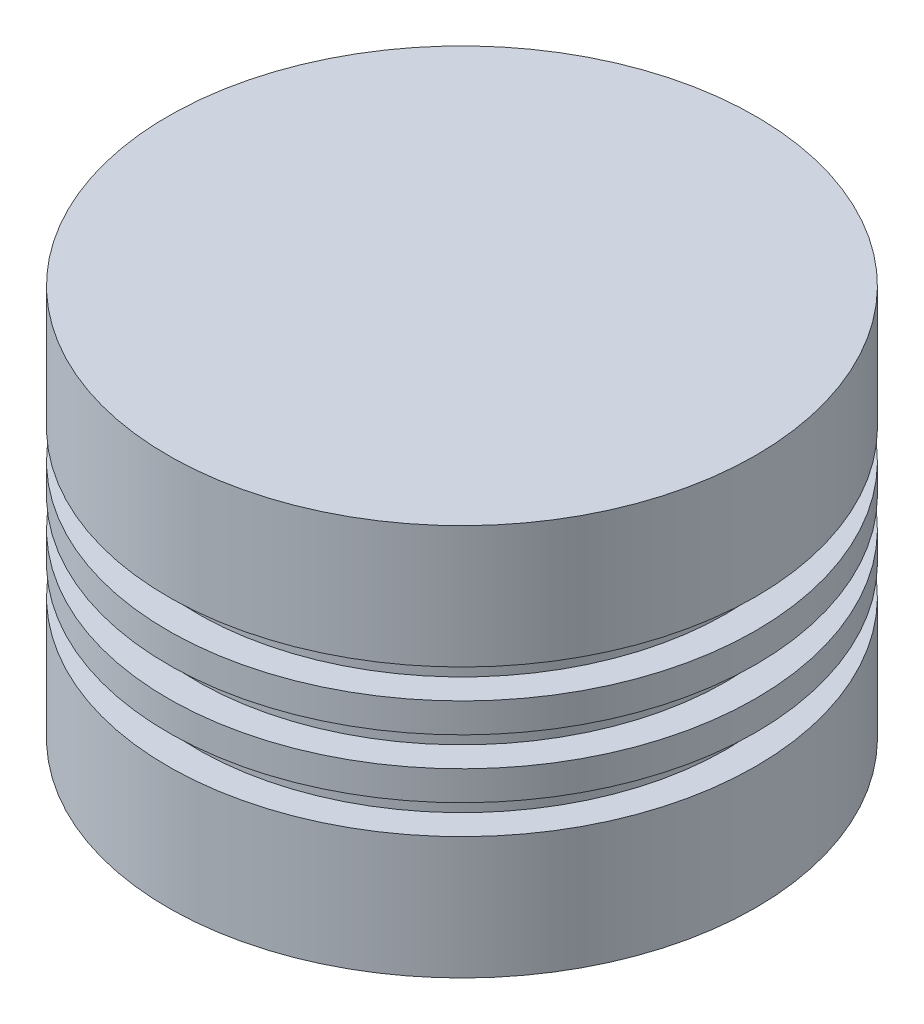
ISO-10303-21;
HEADER;
FILE_DESCRIPTION(('STEP AP214'),'2;1');
FILE_NAME('part.step','',(''),(''),'','','');
FILE_SCHEMA(('AUTOMOTIVE_DESIGN { 1 0 10303 214 1 1 1 1 }'));
ENDSEC;
DATA;
#1=APPLICATION_CONTEXT('core data for automotive mechanical design processes');
#2=APPLICATION_PROTOCOL_DEFINITION('international standard','automotive_design',2000,#1);
#3=PRODUCT_CONTEXT('',#1,'mechanical');
#4=PRODUCT('Part','Part','',(#3));
#5=PRODUCT_RELATED_PRODUCT_CATEGORY('part','',(#4));
#6=PRODUCT_DEFINITION_FORMATION('','',#4);
#7=PRODUCT_DEFINITION_CONTEXT('part definition',#1,'design');
#8=PRODUCT_DEFINITION('design','',#6,#7);
#9=PRODUCT_DEFINITION_SHAPE('','',#8);
#10=(LENGTH_UNIT() NAMED_UNIT(*) SI_UNIT(.MILLI.,.METRE.));
#11=(NAMED_UNIT(*) PLANE_ANGLE_UNIT() SI_UNIT($,.RADIAN.));
#12=(NAMED_UNIT(*) SI_UNIT($,.STERADIAN.) SOLID_ANGLE_UNIT());
#13=UNCERTAINTY_MEASURE_WITH_UNIT(LENGTH_MEASURE(1.E-05),#10,'distance_accuracy_value','');
#14=(GEOMETRIC_REPRESENTATION_CONTEXT(3) GLOBAL_UNCERTAINTY_ASSIGNED_CONTEXT((#13)) GLOBAL_UNIT_ASSIGNED_CONTEXT((#10,
#11,#12)) REPRESENTATION_CONTEXT('',''));
#15=CARTESIAN_POINT('',(0.,0.,0.));
#16=DIRECTION('',(0.,0.,1.));
#17=DIRECTION('',(1.,0.,0.));
#18=AXIS2_PLACEMENT_3D('',#15,#16,#17);
#19=CARTESIAN_POINT('',(31.25,50.,31.25));
#20=DIRECTION('',(1.,0.,0.));
#21=DIRECTION('',(0.,1.,0.));
#22=AXIS2_PLACEMENT_3D('',#19,#20,#21);
#23=PLANE('',#22);
#24=DIRECTION('',(0.,0.,1.));
#25=VECTOR('',#24,1.);
#26=CARTESIAN_POINT('',(31.25,50.,31.25));
#27=LINE('',#26,#25);
#28=CARTESIAN_POINT('',(31.25,50.,-6.24999999999999));
#29=VERTEX_POINT('',#28);
#30=CARTESIAN_POINT('',(31.25,50.,6.25));
#31=VERTEX_POINT('',#30);
#32=EDGE_CURVE('E111',#29,#31,#27,.T.);
#33=ORIENTED_EDGE('',*,*,#32,.F.);
#34=CARTESIAN_POINT('',(31.25,25.,-6.24999999999999));
#35=DIRECTION('',(1.,0.,0.));
#36=DIRECTION('',(0.,1.,0.));
#37=AXIS2_PLACEMENT_3D('',#34,#35,#36);
#38=CIRCLE('',#37,25.);
#39=CARTESIAN_POINT('',(31.25,25.,-31.25));
#40=VERTEX_POINT('',#39);
#41=EDGE_CURVE('E176',#29,#40,#38,.F.);
#42=ORIENTED_EDGE('',*,*,#41,.T.);
#43=DIRECTION('',(0.,-1.,0.));
#44=VECTOR('',#43,1.);
#45=CARTESIAN_POINT('',(31.25,50.,-31.25));
#46=LINE('',#45,#44);
#47=CARTESIAN_POINT('',(31.25,0.,-31.25));
#48=VERTEX_POINT('',#47);
#49=EDGE_CURVE('E115',#40,#48,#46,.T.);
#50=ORIENTED_EDGE('',*,*,#49,.T.);
#51=DIRECTION('',(0.,0.,1.));
#52=VECTOR('',#51,1.);
#53=CARTESIAN_POINT('',(31.25,0.,31.25));
#54=LINE('',#53,#52);
#55=CARTESIAN_POINT('',(31.25,0.,31.25));
#56=VERTEX_POINT('',#55);
#57=EDGE_CURVE('E104',#48,#56,#54,.T.);
#58=ORIENTED_EDGE('',*,*,#57,.T.);
#59=DIRECTION('',(0.,-1.,0.));
#60=VECTOR('',#59,1.);
#61=CARTESIAN_POINT('',(31.25,50.,31.25));
#62=LINE('',#61,#60);
#63=CARTESIAN_POINT('',(31.25,25.,31.25));
#64=VERTEX_POINT('',#63);
#65=EDGE_CURVE('E95',#64,#56,#62,.T.);
#66=ORIENTED_EDGE('',*,*,#65,.F.);
#67=CARTESIAN_POINT('',(31.25,25.,6.25));
#68=DIRECTION('',(1.,0.,0.));
#69=DIRECTION('',(0.,1.,0.));
#70=AXIS2_PLACEMENT_3D('',#67,#68,#69);
#71=CIRCLE('',#70,25.);
#72=EDGE_CURVE('E174',#64,#31,#71,.F.);
#73=ORIENTED_EDGE('',*,*,#72,.T.);
#74=EDGE_LOOP('',(#33,#42,#50,#58,#66,#73));
#75=FACE_BOUND('',#74,.T.);
#76=CARTESIAN_POINT('',(31.25,25.,0.));
#77=DIRECTION('',(1.,0.,0.));
#78=DIRECTION('',(0.,1.,0.));
#79=AXIS2_PLACEMENT_3D('',#76,#77,#78);
#80=CIRCLE('',#79,10.);
#81=CARTESIAN_POINT('',(31.25,25.,-10.));
#82=VERTEX_POINT('',#81);
#83=EDGE_CURVE('E165',#82,#82,#80,.F.);
#84=ORIENTED_EDGE('',*,*,#83,.F.);
#85=EDGE_LOOP('',(#84));
#86=FACE_BOUND('',#85,.T.);
#87=ADVANCED_FACE('F34',(#75,#86),#23,.F.);
#88=CARTESIAN_POINT('',(-31.25,50.,31.25));
#89=DIRECTION('',(-1.,0.,0.));
#90=DIRECTION('',(0.,-1.,0.));
#91=AXIS2_PLACEMENT_3D('',#88,#89,#90);
#92=PLANE('',#91);
#93=DIRECTION('',(0.,-1.,0.));
#94=VECTOR('',#93,1.);
#95=CARTESIAN_POINT('',(-31.25,50.,-31.25));
#96=LINE('',#95,#94);
#97=CARTESIAN_POINT('',(-31.25,25.,-31.25));
#98=VERTEX_POINT('',#97);
#99=CARTESIAN_POINT('',(-31.25,0.,-31.25));
#100=VERTEX_POINT('',#99);
#101=EDGE_CURVE('E94',#98,#100,#96,.T.);
#102=ORIENTED_EDGE('',*,*,#101,.F.);
#103=CARTESIAN_POINT('',(-31.25,25.,-6.24999999999999));
#104=DIRECTION('',(-1.,0.,0.));
#105=DIRECTION('',(0.,-1.,0.));
#106=AXIS2_PLACEMENT_3D('',#103,#104,#105);
#107=CIRCLE('',#106,25.);
#108=CARTESIAN_POINT('',(-31.25,50.,-6.24999999999999));
#109=VERTEX_POINT('',#108);
#110=EDGE_CURVE('E42',#98,#109,#107,.F.);
#111=ORIENTED_EDGE('',*,*,#110,.T.);
#112=DIRECTION('',(0.,0.,-1.));
#113=VECTOR('',#112,1.);
#114=CARTESIAN_POINT('',(-31.25,50.,31.25));
#115=LINE('',#114,#113);
#116=CARTESIAN_POINT('',(-31.25,50.,6.25));
#117=VERTEX_POINT('',#116);
#118=EDGE_CURVE('E120',#117,#109,#115,.T.);
#119=ORIENTED_EDGE('',*,*,#118,.F.);
#120=CARTESIAN_POINT('',(-31.25,25.,6.25));
#121=DIRECTION('',(-1.,0.,0.));
#122=DIRECTION('',(0.,-1.,0.));
#123=AXIS2_PLACEMENT_3D('',#120,#121,#122);
#124=CIRCLE('',#123,25.);
#125=CARTESIAN_POINT('',(-31.25,25.,31.25));
#126=VERTEX_POINT('',#125);
#127=EDGE_CURVE('E49',#117,#126,#124,.F.);
#128=ORIENTED_EDGE('',*,*,#127,.T.);
#129=DIRECTION('',(0.,-1.,0.));
#130=VECTOR('',#129,1.);
#131=CARTESIAN_POINT('',(-31.25,50.,31.25));
#132=LINE('',#131,#130);
#133=CARTESIAN_POINT('',(-31.25,0.,31.25));
#134=VERTEX_POINT('',#133);
#135=EDGE_CURVE('E85',#126,#134,#132,.T.);
#136=ORIENTED_EDGE('',*,*,#135,.T.);
#137=DIRECTION('',(0.,0.,-1.));
#138=VECTOR('',#137,1.);
#139=CARTESIAN_POINT('',(-31.25,0.,31.25));
#140=LINE('',#139,#138);
#141=EDGE_CURVE('E90',#134,#100,#140,.T.);
#142=ORIENTED_EDGE('',*,*,#141,.T.);
#143=EDGE_LOOP('',(#102,#111,#119,#128,#136,#142));
#144=FACE_BOUND('',#143,.T.);
#145=CARTESIAN_POINT('',(-31.25,25.,0.));
#146=DIRECTION('',(-1.,0.,0.));
#147=DIRECTION('',(0.,-1.,0.));
#148=AXIS2_PLACEMENT_3D('',#145,#146,#147);
#149=CIRCLE('',#148,10.);
#150=CARTESIAN_POINT('',(-31.25,25.,-10.));
#151=VERTEX_POINT('',#150);
#152=EDGE_CURVE('E162',#151,#151,#149,.F.);
#153=ORIENTED_EDGE('',*,*,#152,.F.);
#154=EDGE_LOOP('',(#153));
#155=FACE_BOUND('',#154,.T.);
#156=ADVANCED_FACE('F87',(#144,#155),#92,.F.);
#157=CARTESIAN_POINT('',(-75.,0.,0.));
#158=DIRECTION('',(0.,1.,0.));
#159=DIRECTION('',(-1.,0.,0.));
#160=AXIS2_PLACEMENT_3D('',#157,#158,#159);
#161=PLANE('',#160);
#162=DIRECTION('',(-1.,0.,0.));
#163=VECTOR('',#162,1.);
#164=CARTESIAN_POINT('',(-31.25,0.,31.25));
#165=LINE('',#164,#163);
#166=EDGE_CURVE('E98',#56,#134,#165,.T.);
#167=ORIENTED_EDGE('',*,*,#166,.F.);
#168=ORIENTED_EDGE('',*,*,#57,.F.);
#169=DIRECTION('',(1.,0.,0.));
#170=VECTOR('',#169,1.);
#171=CARTESIAN_POINT('',(-31.25,0.,-31.25));
#172=LINE('',#171,#170);
#173=EDGE_CURVE('E109',#100,#48,#172,.T.);
#174=ORIENTED_EDGE('',*,*,#173,.F.);
#175=ORIENTED_EDGE('',*,*,#141,.F.);
#176=EDGE_LOOP('',(#167,#168,#174,#175));
#177=FACE_BOUND('',#176,.T.);
#178=CARTESIAN_POINT('',(0.,0.,0.));
#179=DIRECTION('',(0.,-1.,0.));
#180=DIRECTION('',(1.,0.,0.));
#181=AXIS2_PLACEMENT_3D('',#178,#179,#180);
#182=CIRCLE('',#181,75.);
#183=CARTESIAN_POINT('',(75.,0.,0.));
#184=VERTEX_POINT('',#183);
#185=EDGE_CURVE('E117',#184,#184,#182,.T.);
#186=ORIENTED_EDGE('',*,*,#185,.T.);
#187=EDGE_LOOP('',(#186));
#188=FACE_BOUND('',#187,.T.);
#189=ADVANCED_FACE('F106',(#177,#188),#161,.F.);
#190=CARTESIAN_POINT('',(0.,100.,0.));
#191=DIRECTION('',(0.,-1.,0.));
#192=DIRECTION('',(1.,0.,0.));
#193=AXIS2_PLACEMENT_3D('',#190,#191,#192);
#194=PLANE('',#193);
#195=CARTESIAN_POINT('',(0.,100.,0.));
#196=DIRECTION('',(0.,-1.,0.));
#197=DIRECTION('',(1.,0.,0.));
#198=AXIS2_PLACEMENT_3D('',#195,#196,#197);
#199=CIRCLE('',#198,75.);
#200=CARTESIAN_POINT('',(75.,100.,0.));
#201=VERTEX_POINT('',#200);
#202=EDGE_CURVE('E159',#201,#201,#199,.T.);
#203=ORIENTED_EDGE('',*,*,#202,.F.);
#204=EDGE_LOOP('',(#203));
#205=FACE_BOUND('',#204,.T.);
#206=ADVANCED_FACE('F260',(#205),#194,.F.);
#207=CARTESIAN_POINT('',(0.,0.,0.));
#208=DIRECTION('',(0.,-1.,0.));
#209=DIRECTION('',(1.,0.,0.));
#210=AXIS2_PLACEMENT_3D('',#207,#208,#209);
#211=CYLINDRICAL_SURFACE('',#210,75.);
#212=CARTESIAN_POINT('',(0.,68.75,0.));
#213=DIRECTION('',(0.,-1.,0.));
#214=DIRECTION('',(1.,0.,0.));
#215=AXIS2_PLACEMENT_3D('',#212,#213,#214);
#216=CIRCLE('',#215,75.);
#217=CARTESIAN_POINT('',(75.,68.75,0.));
#218=VERTEX_POINT('',#217);
#219=EDGE_CURVE('E156',#218,#218,#216,.T.);
#220=ORIENTED_EDGE('',*,*,#219,.F.);
#221=EDGE_LOOP('',(#220));
#222=FACE_BOUND('',#221,.T.);
#223=ORIENTED_EDGE('',*,*,#202,.T.);
#224=EDGE_LOOP('',(#223));
#225=FACE_BOUND('',#224,.T.);
#226=ADVANCED_FACE('F256',(#222,#225),#211,.T.);
#227=CARTESIAN_POINT('',(-75.,68.75,0.));
#228=DIRECTION('',(0.,1.,0.));
#229=DIRECTION('',(-1.,0.,0.));
#230=AXIS2_PLACEMENT_3D('',#227,#228,#229);
#231=PLANE('',#230);
#232=CARTESIAN_POINT('',(0.,68.75,0.));
#233=DIRECTION('',(0.,-1.,0.));
#234=DIRECTION('',(1.,0.,0.));
#235=AXIS2_PLACEMENT_3D('',#232,#233,#234);
#236=CIRCLE('',#235,67.5);
#237=CARTESIAN_POINT('',(67.5,68.75,0.));
#238=VERTEX_POINT('',#237);
#239=EDGE_CURVE('E153',#238,#238,#236,.T.);
#240=ORIENTED_EDGE('',*,*,#239,.F.);
#241=EDGE_LOOP('',(#240));
#242=FACE_BOUND('',#241,.T.);
#243=ORIENTED_EDGE('',*,*,#219,.T.);
#244=EDGE_LOOP('',(#243));
#245=FACE_BOUND('',#244,.T.);
#246=ADVANCED_FACE('F252',(#242,#245),#231,.F.);
#247=CARTESIAN_POINT('',(0.,0.,0.));
#248=DIRECTION('',(0.,-1.,0.));
#249=DIRECTION('',(1.,0.,0.));
#250=AXIS2_PLACEMENT_3D('',#247,#248,#249);
#251=CYLINDRICAL_SURFACE('',#250,67.5);
#252=CARTESIAN_POINT('',(0.,61.25,0.));
#253=DIRECTION('',(0.,-1.,0.));
#254=DIRECTION('',(1.,0.,0.));
#255=AXIS2_PLACEMENT_3D('',#252,#253,#254);
#256=CIRCLE('',#255,67.5);
#257=CARTESIAN_POINT('',(67.5,61.25,0.));
#258=VERTEX_POINT('',#257);
#259=EDGE_CURVE('E150',#258,#258,#256,.T.);
#260=ORIENTED_EDGE('',*,*,#259,.F.);
#261=EDGE_LOOP('',(#260));
#262=FACE_BOUND('',#261,.T.);
#263=ORIENTED_EDGE('',*,*,#239,.T.);
#264=EDGE_LOOP('',(#263));
#265=FACE_BOUND('',#264,.T.);
#266=ADVANCED_FACE('F248',(#262,#265),#251,.T.);
#267=CARTESIAN_POINT('',(-67.5,61.25,0.));
#268=DIRECTION('',(0.,-1.,0.));
#269=DIRECTION('',(1.,0.,0.));
#270=AXIS2_PLACEMENT_3D('',#267,#268,#269);
#271=PLANE('',#270);
#272=CARTESIAN_POINT('',(0.,61.25,0.));
#273=DIRECTION('',(0.,-1.,0.));
#274=DIRECTION('',(1.,0.,0.));
#275=AXIS2_PLACEMENT_3D('',#272,#273,#274);
#276=CIRCLE('',#275,75.);
#277=CARTESIAN_POINT('',(75.,61.25,0.));
#278=VERTEX_POINT('',#277);
#279=EDGE_CURVE('E147',#278,#278,#276,.T.);
#280=ORIENTED_EDGE('',*,*,#279,.F.);
#281=EDGE_LOOP('',(#280));
#282=FACE_BOUND('',#281,.T.);
#283=ORIENTED_EDGE('',*,*,#259,.T.);
#284=EDGE_LOOP('',(#283));
#285=FACE_BOUND('',#284,.T.);
#286=ADVANCED_FACE('F244',(#282,#285),#271,.F.);
#287=CARTESIAN_POINT('',(0.,0.,0.));
#288=DIRECTION('',(0.,-1.,0.));
#289=DIRECTION('',(1.,0.,0.));
#290=AXIS2_PLACEMENT_3D('',#287,#288,#289);
#291=CYLINDRICAL_SURFACE('',#290,75.);
#292=CARTESIAN_POINT('',(0.,53.75,0.));
#293=DIRECTION('',(0.,-1.,0.));
#294=DIRECTION('',(1.,0.,0.));
#295=AXIS2_PLACEMENT_3D('',#292,#293,#294);
#296=CIRCLE('',#295,75.);
#297=CARTESIAN_POINT('',(75.,53.75,0.));
#298=VERTEX_POINT('',#297);
#299=EDGE_CURVE('E144',#298,#298,#296,.T.);
#300=ORIENTED_EDGE('',*,*,#299,.F.);
#301=EDGE_LOOP('',(#300));
#302=FACE_BOUND('',#301,.T.);
#303=ORIENTED_EDGE('',*,*,#279,.T.);
#304=EDGE_LOOP('',(#303));
#305=FACE_BOUND('',#304,.T.);
#306=ADVANCED_FACE('F240',(#302,#305),#291,.T.);
#307=CARTESIAN_POINT('',(-75.,53.75,0.));
#308=DIRECTION('',(0.,1.,0.));
#309=DIRECTION('',(-1.,0.,0.));
#310=AXIS2_PLACEMENT_3D('',#307,#308,#309);
#311=PLANE('',#310);
#312=CARTESIAN_POINT('',(0.,53.75,0.));
#313=DIRECTION('',(0.,-1.,0.));
#314=DIRECTION('',(1.,0.,0.));
#315=AXIS2_PLACEMENT_3D('',#312,#313,#314);
#316=CIRCLE('',#315,67.5);
#317=CARTESIAN_POINT('',(67.5,53.75,0.));
#318=VERTEX_POINT('',#317);
#319=EDGE_CURVE('E141',#318,#318,#316,.T.);
#320=ORIENTED_EDGE('',*,*,#319,.F.);
#321=EDGE_LOOP('',(#320));
#322=FACE_BOUND('',#321,.T.);
#323=ORIENTED_EDGE('',*,*,#299,.T.);
#324=EDGE_LOOP('',(#323));
#325=FACE_BOUND('',#324,.T.);
#326=ADVANCED_FACE('F236',(#322,#325),#311,.F.);
#327=CARTESIAN_POINT('',(0.,0.,0.));
#328=DIRECTION('',(0.,-1.,0.));
#329=DIRECTION('',(1.,0.,0.));
#330=AXIS2_PLACEMENT_3D('',#327,#328,#329);
#331=CYLINDRICAL_SURFACE('',#330,67.5);
#332=CARTESIAN_POINT('',(0.,46.25,0.));
#333=DIRECTION('',(0.,-1.,0.));
#334=DIRECTION('',(1.,0.,0.));
#335=AXIS2_PLACEMENT_3D('',#332,#333,#334);
#336=CIRCLE('',#335,67.5);
#337=CARTESIAN_POINT('',(67.5,46.25,0.));
#338=VERTEX_POINT('',#337);
#339=EDGE_CURVE('E138',#338,#338,#336,.T.);
#340=ORIENTED_EDGE('',*,*,#339,.F.);
#341=EDGE_LOOP('',(#340));
#342=FACE_BOUND('',#341,.T.);
#343=ORIENTED_EDGE('',*,*,#319,.T.);
#344=EDGE_LOOP('',(#343));
#345=FACE_BOUND('',#344,.T.);
#346=ADVANCED_FACE('F232',(#342,#345),#331,.T.);
#347=CARTESIAN_POINT('',(-67.5,46.25,0.));
#348=DIRECTION('',(0.,-1.,0.));
#349=DIRECTION('',(1.,0.,0.));
#350=AXIS2_PLACEMENT_3D('',#347,#348,#349);
#351=PLANE('',#350);
#352=CARTESIAN_POINT('',(0.,46.25,0.));
#353=DIRECTION('',(0.,-1.,0.));
#354=DIRECTION('',(1.,0.,0.));
#355=AXIS2_PLACEMENT_3D('',#352,#353,#354);
#356=CIRCLE('',#355,75.);
#357=CARTESIAN_POINT('',(75.,46.25,0.));
#358=VERTEX_POINT('',#357);
#359=EDGE_CURVE('E135',#358,#358,#356,.T.);
#360=ORIENTED_EDGE('',*,*,#359,.F.);
#361=EDGE_LOOP('',(#360));
#362=FACE_BOUND('',#361,.T.);
#363=ORIENTED_EDGE('',*,*,#339,.T.);
#364=EDGE_LOOP('',(#363));
#365=FACE_BOUND('',#364,.T.);
#366=ADVANCED_FACE('F228',(#362,#365),#351,.F.);
#367=CARTESIAN_POINT('',(0.,0.,0.));
#368=DIRECTION('',(0.,-1.,0.));
#369=DIRECTION('',(1.,0.,0.));
#370=AXIS2_PLACEMENT_3D('',#367,#368,#369);
#371=CYLINDRICAL_SURFACE('',#370,75.);
#372=CARTESIAN_POINT('',(0.,38.75,0.));
#373=DIRECTION('',(0.,-1.,0.));
#374=DIRECTION('',(1.,0.,0.));
#375=AXIS2_PLACEMENT_3D('',#372,#373,#374);
#376=CIRCLE('',#375,75.);
#377=CARTESIAN_POINT('',(75.,38.75,0.));
#378=VERTEX_POINT('',#377);
#379=EDGE_CURVE('E132',#378,#378,#376,.T.);
#380=ORIENTED_EDGE('',*,*,#379,.F.);
#381=EDGE_LOOP('',(#380));
#382=FACE_BOUND('',#381,.T.);
#383=ORIENTED_EDGE('',*,*,#359,.T.);
#384=EDGE_LOOP('',(#383));
#385=FACE_BOUND('',#384,.T.);
#386=ADVANCED_FACE('F224',(#382,#385),#371,.T.);
#387=CARTESIAN_POINT('',(-75.,38.75,0.));
#388=DIRECTION('',(0.,1.,0.));
#389=DIRECTION('',(-1.,0.,0.));
#390=AXIS2_PLACEMENT_3D('',#387,#388,#389);
#391=PLANE('',#390);
#392=CARTESIAN_POINT('',(0.,38.75,0.));
#393=DIRECTION('',(0.,-1.,0.));
#394=DIRECTION('',(1.,0.,0.));
#395=AXIS2_PLACEMENT_3D('',#392,#393,#394);
#396=CIRCLE('',#395,67.5);
#397=CARTESIAN_POINT('',(67.5,38.75,0.));
#398=VERTEX_POINT('',#397);
#399=EDGE_CURVE('E129',#398,#398,#396,.T.);
#400=ORIENTED_EDGE('',*,*,#399,.F.);
#401=EDGE_LOOP('',(#400));
#402=FACE_BOUND('',#401,.T.);
#403=ORIENTED_EDGE('',*,*,#379,.T.);
#404=EDGE_LOOP('',(#403));
#405=FACE_BOUND('',#404,.T.);
#406=ADVANCED_FACE('F220',(#402,#405),#391,.F.);
#407=CARTESIAN_POINT('',(0.,0.,0.));
#408=DIRECTION('',(0.,-1.,0.));
#409=DIRECTION('',(1.,0.,0.));
#410=AXIS2_PLACEMENT_3D('',#407,#408,#409);
#411=CYLINDRICAL_SURFACE('',#410,67.5);
#412=CARTESIAN_POINT('',(0.,31.25,0.));
#413=DIRECTION('',(0.,-1.,0.));
#414=DIRECTION('',(1.,0.,0.));
#415=AXIS2_PLACEMENT_3D('',#412,#413,#414);
#416=CIRCLE('',#415,67.5);
#417=CARTESIAN_POINT('',(67.5,31.25,0.));
#418=VERTEX_POINT('',#417);
#419=EDGE_CURVE('E126',#418,#418,#416,.T.);
#420=ORIENTED_EDGE('',*,*,#419,.F.);
#421=EDGE_LOOP('',(#420));
#422=FACE_BOUND('',#421,.T.);
#423=ORIENTED_EDGE('',*,*,#399,.T.);
#424=EDGE_LOOP('',(#423));
#425=FACE_BOUND('',#424,.T.);
#426=ADVANCED_FACE('F216',(#422,#425),#411,.T.);
#427=CARTESIAN_POINT('',(-67.5,31.25,0.));
#428=DIRECTION('',(0.,-1.,0.));
#429=DIRECTION('',(1.,0.,0.));
#430=AXIS2_PLACEMENT_3D('',#427,#428,#429);
#431=PLANE('',#430);
#432=CARTESIAN_POINT('',(0.,31.25,0.));
#433=DIRECTION('',(0.,-1.,0.));
#434=DIRECTION('',(1.,0.,0.));
#435=AXIS2_PLACEMENT_3D('',#432,#433,#434);
#436=CIRCLE('',#435,75.);
#437=CARTESIAN_POINT('',(75.,31.25,0.));
#438=VERTEX_POINT('',#437);
#439=EDGE_CURVE('E123',#438,#438,#436,.T.);
#440=ORIENTED_EDGE('',*,*,#439,.F.);
#441=EDGE_LOOP('',(#440));
#442=FACE_BOUND('',#441,.T.);
#443=ORIENTED_EDGE('',*,*,#419,.T.);
#444=EDGE_LOOP('',(#443));
#445=FACE_BOUND('',#444,.T.);
#446=ADVANCED_FACE('F212',(#442,#445),#431,.F.);
#447=CARTESIAN_POINT('',(0.,0.,0.));
#448=DIRECTION('',(0.,-1.,0.));
#449=DIRECTION('',(1.,0.,0.));
#450=AXIS2_PLACEMENT_3D('',#447,#448,#449);
#451=CYLINDRICAL_SURFACE('',#450,75.);
#452=ORIENTED_EDGE('',*,*,#185,.F.);
#453=EDGE_LOOP('',(#452));
#454=FACE_BOUND('',#453,.T.);
#455=ORIENTED_EDGE('',*,*,#439,.T.);
#456=EDGE_LOOP('',(#455));
#457=FACE_BOUND('',#456,.T.);
#458=ADVANCED_FACE('F209',(#454,#457),#451,.T.);
#459=CARTESIAN_POINT('',(-31.25,50.,-31.25));
#460=DIRECTION('',(0.,0.,-1.));
#461=DIRECTION('',(-1.,0.,0.));
#462=AXIS2_PLACEMENT_3D('',#459,#460,#461);
#463=PLANE('',#462);
#464=ORIENTED_EDGE('',*,*,#49,.F.);
#465=DIRECTION('',(1.,0.,0.));
#466=VECTOR('',#465,1.);
#467=CARTESIAN_POINT('',(-31.25,25.,-31.25));
#468=LINE('',#467,#466);
#469=EDGE_CURVE('E57',#40,#98,#468,.F.);
#470=ORIENTED_EDGE('',*,*,#469,.T.);
#471=ORIENTED_EDGE('',*,*,#101,.T.);
#472=ORIENTED_EDGE('',*,*,#173,.T.);
#473=EDGE_LOOP('',(#464,#470,#471,#472));
#474=FACE_BOUND('',#473,.T.);
#475=ADVANCED_FACE('F192',(#474),#463,.F.);
#476=CARTESIAN_POINT('',(-31.25,50.,31.25));
#477=DIRECTION('',(0.,0.,1.));
#478=DIRECTION('',(1.,0.,0.));
#479=AXIS2_PLACEMENT_3D('',#476,#477,#478);
#480=PLANE('',#479);
#481=ORIENTED_EDGE('',*,*,#135,.F.);
#482=DIRECTION('',(-1.,0.,0.));
#483=VECTOR('',#482,1.);
#484=CARTESIAN_POINT('',(-31.25,25.,31.25));
#485=LINE('',#484,#483);
#486=EDGE_CURVE('E11',#126,#64,#485,.F.);
#487=ORIENTED_EDGE('',*,*,#486,.T.);
#488=ORIENTED_EDGE('',*,*,#65,.T.);
#489=ORIENTED_EDGE('',*,*,#166,.T.);
#490=EDGE_LOOP('',(#481,#487,#488,#489));
#491=FACE_BOUND('',#490,.T.);
#492=ADVANCED_FACE('F99',(#491),#480,.F.);
#493=CARTESIAN_POINT('',(0.,50.,0.));
#494=DIRECTION('',(0.,-1.,0.));
#495=DIRECTION('',(1.,0.,0.));
#496=AXIS2_PLACEMENT_3D('',#493,#494,#495);
#497=PLANE('',#496);
#498=ORIENTED_EDGE('',*,*,#118,.T.);
#499=DIRECTION('',(1.,0.,0.));
#500=VECTOR('',#499,1.);
#501=CARTESIAN_POINT('',(0.,50.,-6.24999999999999));
#502=LINE('',#501,#500);
#503=EDGE_CURVE('E171',#109,#29,#502,.T.);
#504=ORIENTED_EDGE('',*,*,#503,.T.);
#505=ORIENTED_EDGE('',*,*,#32,.T.);
#506=DIRECTION('',(-1.,0.,0.));
#507=VECTOR('',#506,1.);
#508=CARTESIAN_POINT('',(0.,50.,6.25));
#509=LINE('',#508,#507);
#510=EDGE_CURVE('E168',#31,#117,#509,.T.);
#511=ORIENTED_EDGE('',*,*,#510,.T.);
#512=EDGE_LOOP('',(#498,#504,#505,#511));
#513=FACE_BOUND('',#512,.T.);
#514=ADVANCED_FACE('F184',(#513),#497,.T.);
#515=CARTESIAN_POINT('',(-500000.,24.9999999999082,-1.04089913771643E-10));
#516=DIRECTION('',(1.,0.,0.));
#517=DIRECTION('',(0.,0.,-1.));
#518=AXIS2_PLACEMENT_3D('',#515,#516,#517);
#519=CYLINDRICAL_SURFACE('',#518,10.);
#520=CARTESIAN_POINT('',(31.25,25.,-10.));
#521=CARTESIAN_POINT('',(30.5989583333333,25.,-10.));
#522=CARTESIAN_POINT('',(29.9479166666667,25.,-10.));
#523=CARTESIAN_POINT('',(28.6458333333333,25.,-10.));
#524=CARTESIAN_POINT('',(27.9947916666667,25.,-10.));
#525=CARTESIAN_POINT('',(26.6927083333333,25.,-10.));
#526=CARTESIAN_POINT('',(26.0416666666667,25.,-10.));
#527=CARTESIAN_POINT('',(24.7395833333333,25.,-10.));
#528=CARTESIAN_POINT('',(24.0885416666667,25.,-10.));
#529=CARTESIAN_POINT('',(22.7864583333333,25.,-10.));
#530=CARTESIAN_POINT('',(22.1354166666667,25.,-10.));
#531=CARTESIAN_POINT('',(20.8333333333333,25.,-10.));
#532=CARTESIAN_POINT('',(20.1822916666667,25.,-10.));
#533=CARTESIAN_POINT('',(18.8802083333333,25.,-10.));
#534=CARTESIAN_POINT('',(18.2291666666667,25.,-10.));
#535=CARTESIAN_POINT('',(16.9270833333333,25.,-10.));
#536=CARTESIAN_POINT('',(16.2760416666667,25.,-10.));
#537=CARTESIAN_POINT('',(14.9739583333333,25.,-10.));
#538=CARTESIAN_POINT('',(14.3229166666667,25.,-10.));
#539=CARTESIAN_POINT('',(13.0208333333333,25.,-10.));
#540=CARTESIAN_POINT('',(12.3697916666667,25.,-10.));
#541=CARTESIAN_POINT('',(11.0677083333333,25.,-10.));
#542=CARTESIAN_POINT('',(10.4166666666667,25.,-10.));
#543=CARTESIAN_POINT('',(9.11458333333333,25.,-10.));
#544=CARTESIAN_POINT('',(8.46354166666667,25.,-10.));
#545=CARTESIAN_POINT('',(7.16145833333333,25.,-10.));
#546=CARTESIAN_POINT('',(6.51041666666667,25.,-10.));
#547=CARTESIAN_POINT('',(5.20833333333333,25.,-10.));
#548=CARTESIAN_POINT('',(4.55729166666667,25.,-10.));
#549=CARTESIAN_POINT('',(3.25520833333333,25.,-10.));
#550=CARTESIAN_POINT('',(2.60416666666667,25.,-10.));
#551=CARTESIAN_POINT('',(1.30208333333333,25.,-10.));
#552=CARTESIAN_POINT('',(0.651041666666667,25.,-10.));
#553=CARTESIAN_POINT('',(-0.651041666666667,25.,-10.));
#554=CARTESIAN_POINT('',(-1.30208333333333,25.,-10.));
#555=CARTESIAN_POINT('',(-2.60416666666667,25.,-10.));
#556=CARTESIAN_POINT('',(-3.25520833333333,25.,-10.));
#557=CARTESIAN_POINT('',(-4.55729166666667,25.,-10.));
#558=CARTESIAN_POINT('',(-5.20833333333333,25.,-10.));
#559=CARTESIAN_POINT('',(-6.51041666666667,25.,-10.));
#560=CARTESIAN_POINT('',(-7.16145833333333,25.,-10.));
#561=CARTESIAN_POINT('',(-8.46354166666667,25.,-10.));
#562=CARTESIAN_POINT('',(-9.11458333333333,25.,-10.));
#563=CARTESIAN_POINT('',(-10.4166666666667,25.,-10.));
#564=CARTESIAN_POINT('',(-11.0677083333333,25.,-10.));
#565=CARTESIAN_POINT('',(-12.3697916666667,25.,-10.));
#566=CARTESIAN_POINT('',(-13.0208333333333,25.,-10.));
#567=CARTESIAN_POINT('',(-14.3229166666667,25.,-10.));
#568=CARTESIAN_POINT('',(-14.9739583333333,25.,-10.));
#569=CARTESIAN_POINT('',(-16.2760416666667,25.,-10.));
#570=CARTESIAN_POINT('',(-16.9270833333333,25.,-10.));
#571=CARTESIAN_POINT('',(-18.2291666666667,25.,-10.));
#572=CARTESIAN_POINT('',(-18.8802083333333,25.,-10.));
#573=CARTESIAN_POINT('',(-20.1822916666667,25.,-10.));
#574=CARTESIAN_POINT('',(-20.8333333333333,25.,-10.));
#575=CARTESIAN_POINT('',(-22.1354166666667,25.,-10.));
#576=CARTESIAN_POINT('',(-22.7864583333333,25.,-10.));
#577=CARTESIAN_POINT('',(-24.0885416666667,25.,-10.));
#578=CARTESIAN_POINT('',(-24.7395833333333,25.,-10.));
#579=CARTESIAN_POINT('',(-26.0416666666667,25.,-10.));
#580=CARTESIAN_POINT('',(-26.6927083333333,25.,-10.));
#581=CARTESIAN_POINT('',(-27.9947916666667,25.,-10.));
#582=CARTESIAN_POINT('',(-28.6458333333333,25.,-10.));
#583=CARTESIAN_POINT('',(-29.9479166666667,25.,-10.));
#584=CARTESIAN_POINT('',(-30.5989583333333,25.,-10.));
#585=CARTESIAN_POINT('',(-31.25,25.,-10.));
#586=B_SPLINE_CURVE_WITH_KNOTS('',3,(#520,#521,#522,#523,#524,#525,#526,#527,#528,#529,#530,
#531,#532,#533,#534,#535,#536,#537,#538,#539,#540,#541,#542,#543,#544,#545,#546,#547,#548,#549,
#550,#551,#552,#553,#554,#555,#556,#557,#558,#559,#560,#561,#562,#563,#564,#565,#566,#567,#568,
#569,#570,#571,#572,#573,#574,#575,#576,#577,#578,#579,#580,#581,#582,#583,#584,#585),
.UNSPECIFIED.,.F.,.F.,(4,2,2,2,2,2,2,2,2,2,2,2,2,2,2,2,2,2,2,2,2,2,2,2,2,2,2,2,2,2,2,2,4),(0.,
1.953125,3.90625,5.859375,7.8125,9.765625,11.71875,13.671875,15.625,17.578125,19.53125,
21.484375,23.4375,25.390625,27.34375,29.296875,31.25,33.203125,35.15625,37.109375,39.0625,
41.015625,42.96875,44.921875,46.875,48.828125,50.78125,52.734375,54.6875,56.640625,58.59375,
60.546875,62.5),.UNSPECIFIED.);
#587=EDGE_CURVE('BSEAM200',#82,#151,#586,.T.);
#588=ORIENTED_EDGE('',*,*,#83,.T.);
#589=ORIENTED_EDGE('',*,*,#152,.T.);
#590=ORIENTED_EDGE('',*,*,#587,.T.);
#591=ORIENTED_EDGE('',*,*,#587,.F.);
#592=EDGE_LOOP('',(#588,#590,#589,#591));
#593=FACE_BOUND('',#592,.T.);
#594=ADVANCED_FACE('F200',(#593),#519,.T.);
#595=CARTESIAN_POINT('',(0.,25.,-6.24999999999999));
#596=DIRECTION('',(1.,0.,0.));
#597=DIRECTION('',(0.,1.,0.));
#598=AXIS2_PLACEMENT_3D('',#595,#596,#597);
#599=CYLINDRICAL_SURFACE('',#598,25.);
#600=ORIENTED_EDGE('',*,*,#110,.F.);
#601=ORIENTED_EDGE('',*,*,#469,.F.);
#602=ORIENTED_EDGE('',*,*,#41,.F.);
#603=ORIENTED_EDGE('',*,*,#503,.F.);
#604=EDGE_LOOP('',(#600,#601,#602,#603));
#605=FACE_BOUND('',#604,.T.);
#606=ADVANCED_FACE('F189',(#605),#599,.F.);
#607=CARTESIAN_POINT('',(0.,25.,6.25));
#608=DIRECTION('',(-1.,0.,0.));
#609=DIRECTION('',(0.,-1.,0.));
#610=AXIS2_PLACEMENT_3D('',#607,#608,#609);
#611=CYLINDRICAL_SURFACE('',#610,25.);
#612=ORIENTED_EDGE('',*,*,#72,.F.);
#613=ORIENTED_EDGE('',*,*,#486,.F.);
#614=ORIENTED_EDGE('',*,*,#127,.F.);
#615=ORIENTED_EDGE('',*,*,#510,.F.);
#616=EDGE_LOOP('',(#612,#613,#614,#615));
#617=FACE_BOUND('',#616,.T.);
#618=ADVANCED_FACE('F36',(#617),#611,.F.);
#619=CLOSED_SHELL('',(#87,#156,#189,#206,#226,#246,#266,#286,#306,#326,#346,#366,#386,#406,#426,
#446,#458,#475,#492,#514,#594,#606,#618));
#620=MANIFOLD_SOLID_BREP('B2',#619);
#621=ADVANCED_BREP_SHAPE_REPRESENTATION('',(#18,#620),#14);
#622=SHAPE_DEFINITION_REPRESENTATION(#9,#621);
ENDSEC;
END-ISO-10303-21;
